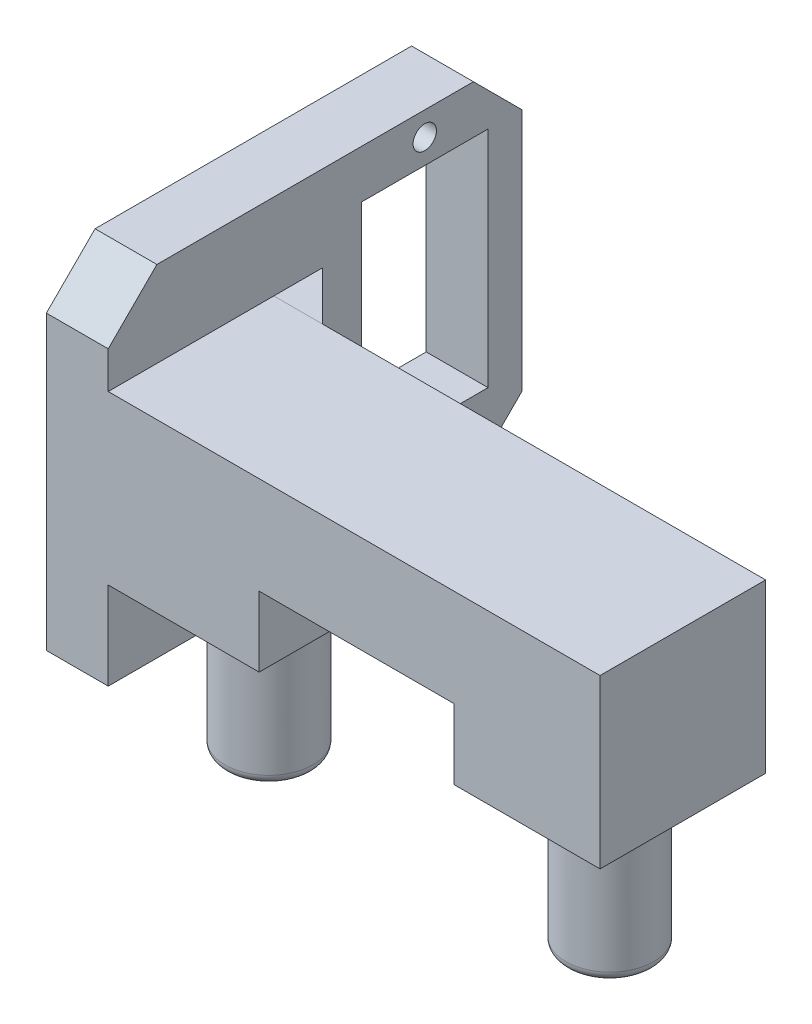
ISO-10303-21;
HEADER;
FILE_DESCRIPTION(('STEP AP214'),'2;1');
FILE_NAME('part.step','',(''),(''),'','','');
FILE_SCHEMA(('AUTOMOTIVE_DESIGN { 1 0 10303 214 1 1 1 1 }'));
ENDSEC;
DATA;
#1=APPLICATION_CONTEXT('core data for automotive mechanical design processes');
#2=APPLICATION_PROTOCOL_DEFINITION('international standard','automotive_design',2000,#1);
#3=PRODUCT_CONTEXT('',#1,'mechanical');
#4=PRODUCT('Part','Part','',(#3));
#5=PRODUCT_RELATED_PRODUCT_CATEGORY('part','',(#4));
#6=PRODUCT_DEFINITION_FORMATION('','',#4);
#7=PRODUCT_DEFINITION_CONTEXT('part definition',#1,'design');
#8=PRODUCT_DEFINITION('design','',#6,#7);
#9=PRODUCT_DEFINITION_SHAPE('','',#8);
#10=(LENGTH_UNIT() NAMED_UNIT(*) SI_UNIT(.MILLI.,.METRE.));
#11=(NAMED_UNIT(*) PLANE_ANGLE_UNIT() SI_UNIT($,.RADIAN.));
#12=(NAMED_UNIT(*) SI_UNIT($,.STERADIAN.) SOLID_ANGLE_UNIT());
#13=UNCERTAINTY_MEASURE_WITH_UNIT(LENGTH_MEASURE(1.E-05),#10,'distance_accuracy_value','');
#14=(GEOMETRIC_REPRESENTATION_CONTEXT(3) GLOBAL_UNCERTAINTY_ASSIGNED_CONTEXT((#13)) GLOBAL_UNIT_ASSIGNED_CONTEXT((#10,
#11,#12)) REPRESENTATION_CONTEXT('',''));
#15=CARTESIAN_POINT('',(0.,0.,0.));
#16=DIRECTION('',(0.,0.,1.));
#17=DIRECTION('',(1.,0.,0.));
#18=AXIS2_PLACEMENT_3D('',#15,#16,#17);
#19=CARTESIAN_POINT('',(-20.25,-7.,-8.5));
#20=DIRECTION('',(-0.707106781186547,0.,0.707106781186547));
#21=DIRECTION('',(0.707106781186548,0.,0.707106781186548));
#22=AXIS2_PLACEMENT_3D('',#19,#20,#21);
#23=PLANE('',#22);
#24=DIRECTION('',(0.707106781186548,0.,0.707106781186548));
#25=VECTOR('',#24,1.);
#26=CARTESIAN_POINT('',(-20.25,-4.,-8.5));
#27=LINE('',#26,#25);
#28=CARTESIAN_POINT('',(-25.25,-4.,-13.5));
#29=VERTEX_POINT('',#28);
#30=CARTESIAN_POINT('',(-20.25,-4.,-8.5));
#31=VERTEX_POINT('',#30);
#32=EDGE_CURVE('E107',#29,#31,#27,.T.);
#33=ORIENTED_EDGE('',*,*,#32,.T.);
#34=DIRECTION('',(0.,1.,0.));
#35=VECTOR('',#34,1.);
#36=CARTESIAN_POINT('',(-20.25,-7.,-8.5));
#37=LINE('',#36,#35);
#38=CARTESIAN_POINT('',(-20.25,-7.,-8.5));
#39=VERTEX_POINT('',#38);
#40=EDGE_CURVE('E12',#39,#31,#37,.T.);
#41=ORIENTED_EDGE('',*,*,#40,.F.);
#42=DIRECTION('',(0.707106781186548,0.,0.707106781186548));
#43=VECTOR('',#42,1.);
#44=CARTESIAN_POINT('',(-20.25,-7.,-8.5));
#45=LINE('',#44,#43);
#46=CARTESIAN_POINT('',(-25.25,-7.,-13.5));
#47=VERTEX_POINT('',#46);
#48=EDGE_CURVE('E100',#47,#39,#45,.T.);
#49=ORIENTED_EDGE('',*,*,#48,.F.);
#50=DIRECTION('',(0.,1.,0.));
#51=VECTOR('',#50,1.);
#52=CARTESIAN_POINT('',(-25.25,-7.,-13.5));
#53=LINE('',#52,#51);
#54=EDGE_CURVE('E108',#47,#29,#53,.T.);
#55=ORIENTED_EDGE('',*,*,#54,.T.);
#56=EDGE_LOOP('',(#33,#41,#49,#55));
#57=FACE_BOUND('',#56,.T.);
#58=ADVANCED_FACE('F60',(#57),#23,.F.);
#59=CARTESIAN_POINT('',(-25.25,-7.,-8.5));
#60=DIRECTION('',(0.,0.,-1.));
#61=DIRECTION('',(-1.,0.,0.));
#62=AXIS2_PLACEMENT_3D('',#59,#60,#61);
#63=PLANE('',#62);
#64=DIRECTION('',(-1.,0.,0.));
#65=VECTOR('',#64,1.);
#66=CARTESIAN_POINT('',(-25.25,-4.,-8.5));
#67=LINE('',#66,#65);
#68=CARTESIAN_POINT('',(-25.25,-4.,-8.5));
#69=VERTEX_POINT('',#68);
#70=EDGE_CURVE('E88',#31,#69,#67,.T.);
#71=ORIENTED_EDGE('',*,*,#70,.T.);
#72=DIRECTION('',(0.,1.,0.));
#73=VECTOR('',#72,1.);
#74=CARTESIAN_POINT('',(-25.25,-7.,-8.5));
#75=LINE('',#74,#73);
#76=CARTESIAN_POINT('',(-25.25,-7.,-8.5));
#77=VERTEX_POINT('',#76);
#78=EDGE_CURVE('E68',#77,#69,#75,.T.);
#79=ORIENTED_EDGE('',*,*,#78,.F.);
#80=DIRECTION('',(-1.,0.,0.));
#81=VECTOR('',#80,1.);
#82=CARTESIAN_POINT('',(-25.25,-7.,-8.5));
#83=LINE('',#82,#81);
#84=EDGE_CURVE('E96',#39,#77,#83,.T.);
#85=ORIENTED_EDGE('',*,*,#84,.F.);
#86=ORIENTED_EDGE('',*,*,#40,.T.);
#87=EDGE_LOOP('',(#71,#79,#85,#86));
#88=FACE_BOUND('',#87,.T.);
#89=ADVANCED_FACE('F97',(#88),#63,.F.);
#90=CARTESIAN_POINT('',(-25.25,-7.,-8.5));
#91=DIRECTION('',(1.,0.,0.));
#92=DIRECTION('',(0.,0.,-1.));
#93=AXIS2_PLACEMENT_3D('',#90,#91,#92);
#94=PLANE('',#93);
#95=DIRECTION('',(0.,0.,-1.));
#96=VECTOR('',#95,1.);
#97=CARTESIAN_POINT('',(-25.25,-4.,-8.5));
#98=LINE('',#97,#96);
#99=EDGE_CURVE('E93',#69,#29,#98,.T.);
#100=ORIENTED_EDGE('',*,*,#99,.T.);
#101=ORIENTED_EDGE('',*,*,#54,.F.);
#102=DIRECTION('',(0.,0.,-1.));
#103=VECTOR('',#102,1.);
#104=CARTESIAN_POINT('',(-25.25,-7.,-8.5));
#105=LINE('',#104,#103);
#106=EDGE_CURVE('E76',#77,#47,#105,.T.);
#107=ORIENTED_EDGE('',*,*,#106,.F.);
#108=ORIENTED_EDGE('',*,*,#78,.T.);
#109=EDGE_LOOP('',(#100,#101,#107,#108));
#110=FACE_BOUND('',#109,.T.);
#111=ADVANCED_FACE('F115',(#110),#94,.F.);
#112=CARTESIAN_POINT('',(0.,-7.,0.));
#113=DIRECTION('',(0.,-1.,0.));
#114=DIRECTION('',(0.,0.,-1.));
#115=AXIS2_PLACEMENT_3D('',#112,#113,#114);
#116=PLANE('',#115);
#117=ORIENTED_EDGE('',*,*,#48,.T.);
#118=ORIENTED_EDGE('',*,*,#84,.T.);
#119=ORIENTED_EDGE('',*,*,#106,.T.);
#120=EDGE_LOOP('',(#117,#118,#119));
#121=FACE_BOUND('',#120,.T.);
#122=ADVANCED_FACE('F103',(#121),#116,.T.);
#123=CARTESIAN_POINT('',(0.,-4.,0.));
#124=DIRECTION('',(0.,-1.,0.));
#125=DIRECTION('',(0.,0.,-1.));
#126=AXIS2_PLACEMENT_3D('',#123,#124,#125);
#127=PLANE('',#126);
#128=ORIENTED_EDGE('',*,*,#32,.F.);
#129=ORIENTED_EDGE('',*,*,#99,.F.);
#130=ORIENTED_EDGE('',*,*,#70,.F.);
#131=EDGE_LOOP('',(#128,#129,#130));
#132=FACE_BOUND('',#131,.T.);
#133=ADVANCED_FACE('F116',(#132),#127,.F.);
#134=CLOSED_SHELL('',(#58,#89,#111,#122,#133));
#135=MANIFOLD_SOLID_BREP('B2',#134);
#136=CARTESIAN_POINT('',(-20.25,0.,-8.5));
#137=DIRECTION('',(-0.707106781186547,0.,0.707106781186547));
#138=DIRECTION('',(0.707106781186548,0.,0.707106781186548));
#139=AXIS2_PLACEMENT_3D('',#136,#137,#138);
#140=PLANE('',#139);
#141=DIRECTION('',(0.707106781186548,0.,0.707106781186548));
#142=VECTOR('',#141,1.);
#143=CARTESIAN_POINT('',(-20.25,3.,-8.5));
#144=LINE('',#143,#142);
#145=CARTESIAN_POINT('',(-25.25,3.,-13.5));
#146=VERTEX_POINT('',#145);
#147=CARTESIAN_POINT('',(-20.25,3.,-8.5));
#148=VERTEX_POINT('',#147);
#149=EDGE_CURVE('E215',#146,#148,#144,.T.);
#150=ORIENTED_EDGE('',*,*,#149,.T.);
#151=DIRECTION('',(0.,1.,0.));
#152=VECTOR('',#151,1.);
#153=CARTESIAN_POINT('',(-20.25,0.,-8.5));
#154=LINE('',#153,#152);
#155=CARTESIAN_POINT('',(-20.25,0.,-8.5));
#156=VERTEX_POINT('',#155);
#157=EDGE_CURVE('E58',#156,#148,#154,.T.);
#158=ORIENTED_EDGE('',*,*,#157,.F.);
#159=DIRECTION('',(0.707106781186548,0.,0.707106781186548));
#160=VECTOR('',#159,1.);
#161=CARTESIAN_POINT('',(-20.25,0.,-8.5));
#162=LINE('',#161,#160);
#163=CARTESIAN_POINT('',(-25.25,0.,-13.5));
#164=VERTEX_POINT('',#163);
#165=EDGE_CURVE('E208',#164,#156,#162,.T.);
#166=ORIENTED_EDGE('',*,*,#165,.F.);
#167=DIRECTION('',(0.,1.,0.));
#168=VECTOR('',#167,1.);
#169=CARTESIAN_POINT('',(-25.25,0.,-13.5));
#170=LINE('',#169,#168);
#171=EDGE_CURVE('E216',#164,#146,#170,.T.);
#172=ORIENTED_EDGE('',*,*,#171,.T.);
#173=EDGE_LOOP('',(#150,#158,#166,#172));
#174=FACE_BOUND('',#173,.T.);
#175=ADVANCED_FACE('F168',(#174),#140,.F.);
#176=CARTESIAN_POINT('',(-25.25,0.,-8.5));
#177=DIRECTION('',(0.,0.,-1.));
#178=DIRECTION('',(-1.,0.,0.));
#179=AXIS2_PLACEMENT_3D('',#176,#177,#178);
#180=PLANE('',#179);
#181=DIRECTION('',(-1.,0.,0.));
#182=VECTOR('',#181,1.);
#183=CARTESIAN_POINT('',(-25.25,3.,-8.5));
#184=LINE('',#183,#182);
#185=CARTESIAN_POINT('',(-25.25,3.,-8.5));
#186=VERTEX_POINT('',#185);
#187=EDGE_CURVE('E196',#148,#186,#184,.T.);
#188=ORIENTED_EDGE('',*,*,#187,.T.);
#189=DIRECTION('',(0.,1.,0.));
#190=VECTOR('',#189,1.);
#191=CARTESIAN_POINT('',(-25.25,0.,-8.5));
#192=LINE('',#191,#190);
#193=CARTESIAN_POINT('',(-25.25,0.,-8.5));
#194=VERTEX_POINT('',#193);
#195=EDGE_CURVE('E176',#194,#186,#192,.T.);
#196=ORIENTED_EDGE('',*,*,#195,.F.);
#197=DIRECTION('',(-1.,0.,0.));
#198=VECTOR('',#197,1.);
#199=CARTESIAN_POINT('',(-25.25,0.,-8.5));
#200=LINE('',#199,#198);
#201=EDGE_CURVE('E204',#156,#194,#200,.T.);
#202=ORIENTED_EDGE('',*,*,#201,.F.);
#203=ORIENTED_EDGE('',*,*,#157,.T.);
#204=EDGE_LOOP('',(#188,#196,#202,#203));
#205=FACE_BOUND('',#204,.T.);
#206=ADVANCED_FACE('F205',(#205),#180,.F.);
#207=CARTESIAN_POINT('',(-25.25,0.,-8.5));
#208=DIRECTION('',(1.,0.,0.));
#209=DIRECTION('',(0.,0.,-1.));
#210=AXIS2_PLACEMENT_3D('',#207,#208,#209);
#211=PLANE('',#210);
#212=DIRECTION('',(0.,0.,-1.));
#213=VECTOR('',#212,1.);
#214=CARTESIAN_POINT('',(-25.25,3.,-8.5));
#215=LINE('',#214,#213);
#216=EDGE_CURVE('E201',#186,#146,#215,.T.);
#217=ORIENTED_EDGE('',*,*,#216,.T.);
#218=ORIENTED_EDGE('',*,*,#171,.F.);
#219=DIRECTION('',(0.,0.,-1.));
#220=VECTOR('',#219,1.);
#221=CARTESIAN_POINT('',(-25.25,0.,-8.5));
#222=LINE('',#221,#220);
#223=EDGE_CURVE('E184',#194,#164,#222,.T.);
#224=ORIENTED_EDGE('',*,*,#223,.F.);
#225=ORIENTED_EDGE('',*,*,#195,.T.);
#226=EDGE_LOOP('',(#217,#218,#224,#225));
#227=FACE_BOUND('',#226,.T.);
#228=ADVANCED_FACE('F223',(#227),#211,.F.);
#229=CARTESIAN_POINT('',(0.,0.,0.));
#230=DIRECTION('',(0.,-1.,0.));
#231=DIRECTION('',(0.,0.,-1.));
#232=AXIS2_PLACEMENT_3D('',#229,#230,#231);
#233=PLANE('',#232);
#234=ORIENTED_EDGE('',*,*,#165,.T.);
#235=ORIENTED_EDGE('',*,*,#201,.T.);
#236=ORIENTED_EDGE('',*,*,#223,.T.);
#237=EDGE_LOOP('',(#234,#235,#236));
#238=FACE_BOUND('',#237,.T.);
#239=ADVANCED_FACE('F211',(#238),#233,.T.);
#240=CARTESIAN_POINT('',(0.,3.,0.));
#241=DIRECTION('',(0.,-1.,0.));
#242=DIRECTION('',(0.,0.,-1.));
#243=AXIS2_PLACEMENT_3D('',#240,#241,#242);
#244=PLANE('',#243);
#245=ORIENTED_EDGE('',*,*,#149,.F.);
#246=ORIENTED_EDGE('',*,*,#216,.F.);
#247=ORIENTED_EDGE('',*,*,#187,.F.);
#248=EDGE_LOOP('',(#245,#246,#247));
#249=FACE_BOUND('',#248,.T.);
#250=ADVANCED_FACE('F224',(#249),#244,.F.);
#251=CLOSED_SHELL('',(#175,#206,#228,#239,#250));
#252=MANIFOLD_SOLID_BREP('B6',#251);
#253=CARTESIAN_POINT('',(-20.25,7.,-8.5));
#254=DIRECTION('',(-0.707106781186547,0.,0.707106781186547));
#255=DIRECTION('',(0.707106781186548,0.,0.707106781186548));
#256=AXIS2_PLACEMENT_3D('',#253,#254,#255);
#257=PLANE('',#256);
#258=DIRECTION('',(0.707106781186548,0.,0.707106781186548));
#259=VECTOR('',#258,1.);
#260=CARTESIAN_POINT('',(-20.25,10.,-8.5));
#261=LINE('',#260,#259);
#262=CARTESIAN_POINT('',(-25.25,10.,-13.5));
#263=VERTEX_POINT('',#262);
#264=CARTESIAN_POINT('',(-20.25,10.,-8.5));
#265=VERTEX_POINT('',#264);
#266=EDGE_CURVE('E323',#263,#265,#261,.T.);
#267=ORIENTED_EDGE('',*,*,#266,.T.);
#268=DIRECTION('',(0.,1.,0.));
#269=VECTOR('',#268,1.);
#270=CARTESIAN_POINT('',(-20.25,7.,-8.5));
#271=LINE('',#270,#269);
#272=CARTESIAN_POINT('',(-20.25,7.,-8.5));
#273=VERTEX_POINT('',#272);
#274=EDGE_CURVE('E166',#273,#265,#271,.T.);
#275=ORIENTED_EDGE('',*,*,#274,.F.);
#276=DIRECTION('',(0.707106781186548,0.,0.707106781186548));
#277=VECTOR('',#276,1.);
#278=CARTESIAN_POINT('',(-20.25,7.,-8.5));
#279=LINE('',#278,#277);
#280=CARTESIAN_POINT('',(-25.25,7.,-13.5));
#281=VERTEX_POINT('',#280);
#282=EDGE_CURVE('E316',#281,#273,#279,.T.);
#283=ORIENTED_EDGE('',*,*,#282,.F.);
#284=DIRECTION('',(0.,1.,0.));
#285=VECTOR('',#284,1.);
#286=CARTESIAN_POINT('',(-25.25,7.,-13.5));
#287=LINE('',#286,#285);
#288=EDGE_CURVE('E324',#281,#263,#287,.T.);
#289=ORIENTED_EDGE('',*,*,#288,.T.);
#290=EDGE_LOOP('',(#267,#275,#283,#289));
#291=FACE_BOUND('',#290,.T.);
#292=ADVANCED_FACE('F276',(#291),#257,.F.);
#293=CARTESIAN_POINT('',(-25.25,7.,-8.5));
#294=DIRECTION('',(0.,0.,-1.));
#295=DIRECTION('',(-1.,0.,0.));
#296=AXIS2_PLACEMENT_3D('',#293,#294,#295);
#297=PLANE('',#296);
#298=DIRECTION('',(-1.,0.,0.));
#299=VECTOR('',#298,1.);
#300=CARTESIAN_POINT('',(-25.25,10.,-8.5));
#301=LINE('',#300,#299);
#302=CARTESIAN_POINT('',(-25.25,10.,-8.5));
#303=VERTEX_POINT('',#302);
#304=EDGE_CURVE('E304',#265,#303,#301,.T.);
#305=ORIENTED_EDGE('',*,*,#304,.T.);
#306=DIRECTION('',(0.,1.,0.));
#307=VECTOR('',#306,1.);
#308=CARTESIAN_POINT('',(-25.25,7.,-8.5));
#309=LINE('',#308,#307);
#310=CARTESIAN_POINT('',(-25.25,7.,-8.5));
#311=VERTEX_POINT('',#310);
#312=EDGE_CURVE('E284',#311,#303,#309,.T.);
#313=ORIENTED_EDGE('',*,*,#312,.F.);
#314=DIRECTION('',(-1.,0.,0.));
#315=VECTOR('',#314,1.);
#316=CARTESIAN_POINT('',(-25.25,7.,-8.5));
#317=LINE('',#316,#315);
#318=EDGE_CURVE('E312',#273,#311,#317,.T.);
#319=ORIENTED_EDGE('',*,*,#318,.F.);
#320=ORIENTED_EDGE('',*,*,#274,.T.);
#321=EDGE_LOOP('',(#305,#313,#319,#320));
#322=FACE_BOUND('',#321,.T.);
#323=ADVANCED_FACE('F313',(#322),#297,.F.);
#324=CARTESIAN_POINT('',(-25.25,7.,-8.5));
#325=DIRECTION('',(1.,0.,0.));
#326=DIRECTION('',(0.,0.,-1.));
#327=AXIS2_PLACEMENT_3D('',#324,#325,#326);
#328=PLANE('',#327);
#329=DIRECTION('',(0.,0.,-1.));
#330=VECTOR('',#329,1.);
#331=CARTESIAN_POINT('',(-25.25,10.,-8.5));
#332=LINE('',#331,#330);
#333=EDGE_CURVE('E309',#303,#263,#332,.T.);
#334=ORIENTED_EDGE('',*,*,#333,.T.);
#335=ORIENTED_EDGE('',*,*,#288,.F.);
#336=DIRECTION('',(0.,0.,-1.));
#337=VECTOR('',#336,1.);
#338=CARTESIAN_POINT('',(-25.25,7.,-8.5));
#339=LINE('',#338,#337);
#340=EDGE_CURVE('E292',#311,#281,#339,.T.);
#341=ORIENTED_EDGE('',*,*,#340,.F.);
#342=ORIENTED_EDGE('',*,*,#312,.T.);
#343=EDGE_LOOP('',(#334,#335,#341,#342));
#344=FACE_BOUND('',#343,.T.);
#345=ADVANCED_FACE('F331',(#344),#328,.F.);
#346=CARTESIAN_POINT('',(0.,7.,0.));
#347=DIRECTION('',(0.,-1.,0.));
#348=DIRECTION('',(0.,0.,-1.));
#349=AXIS2_PLACEMENT_3D('',#346,#347,#348);
#350=PLANE('',#349);
#351=ORIENTED_EDGE('',*,*,#282,.T.);
#352=ORIENTED_EDGE('',*,*,#318,.T.);
#353=ORIENTED_EDGE('',*,*,#340,.T.);
#354=EDGE_LOOP('',(#351,#352,#353));
#355=FACE_BOUND('',#354,.T.);
#356=ADVANCED_FACE('F319',(#355),#350,.T.);
#357=CARTESIAN_POINT('',(0.,10.,0.));
#358=DIRECTION('',(0.,-1.,0.));
#359=DIRECTION('',(0.,0.,-1.));
#360=AXIS2_PLACEMENT_3D('',#357,#358,#359);
#361=PLANE('',#360);
#362=ORIENTED_EDGE('',*,*,#266,.F.);
#363=ORIENTED_EDGE('',*,*,#333,.F.);
#364=ORIENTED_EDGE('',*,*,#304,.F.);
#365=EDGE_LOOP('',(#362,#363,#364));
#366=FACE_BOUND('',#365,.T.);
#367=ADVANCED_FACE('F332',(#366),#361,.F.);
#368=CLOSED_SHELL('',(#292,#323,#345,#356,#367));
#369=MANIFOLD_SOLID_BREP('B52',#368);
#370=CARTESIAN_POINT('',(-31.6,0.,0.));
#371=DIRECTION('',(1.,0.,0.));
#372=DIRECTION('',(0.,0.,-1.));
#373=AXIS2_PLACEMENT_3D('',#370,#371,#372);
#374=PLANE('',#373);
#375=CARTESIAN_POINT('',(-31.6,-11.4369999999982,-24.));
#376=DIRECTION('',(-1.,0.,0.));
#377=DIRECTION('',(0.,0.,1.));
#378=AXIS2_PLACEMENT_3D('',#375,#376,#377);
#379=CIRCLE('',#378,1.19999999999999);
#380=CARTESIAN_POINT('',(-31.6,-11.4369999999982,-22.8));
#381=VERTEX_POINT('',#380);
#382=EDGE_CURVE('E810',#381,#381,#379,.T.);
#383=ORIENTED_EDGE('',*,*,#382,.F.);
#384=EDGE_LOOP('',(#383));
#385=FACE_BOUND('',#384,.T.);
#386=DIRECTION('',(0.,-1.,0.));
#387=VECTOR('',#386,1.);
#388=CARTESIAN_POINT('',(-31.6,13.847,-17.5));
#389=LINE('',#388,#387);
#390=CARTESIAN_POINT('',(-31.6,13.847,-17.5));
#391=VERTEX_POINT('',#390);
#392=CARTESIAN_POINT('',(-31.6,-9.153,-17.5));
#393=VERTEX_POINT('',#392);
#394=EDGE_CURVE('E546',#391,#393,#389,.T.);
#395=ORIENTED_EDGE('',*,*,#394,.T.);
#396=DIRECTION('',(0.,0.,1.));
#397=VECTOR('',#396,1.);
#398=CARTESIAN_POINT('',(-31.6,-9.153,-30.5));
#399=LINE('',#398,#397);
#400=CARTESIAN_POINT('',(-31.6,-9.153,-30.5));
#401=VERTEX_POINT('',#400);
#402=EDGE_CURVE('E818',#401,#393,#399,.T.);
#403=ORIENTED_EDGE('',*,*,#402,.F.);
#404=DIRECTION('',(0.,-1.,0.));
#405=VECTOR('',#404,1.);
#406=CARTESIAN_POINT('',(-31.6,13.847,-30.5));
#407=LINE('',#406,#405);
#408=CARTESIAN_POINT('',(-31.6,13.847,-30.5));
#409=VERTEX_POINT('',#408);
#410=EDGE_CURVE('E517',#409,#401,#407,.T.);
#411=ORIENTED_EDGE('',*,*,#410,.F.);
#412=DIRECTION('',(0.,0.,1.));
#413=VECTOR('',#412,1.);
#414=CARTESIAN_POINT('',(-31.6,13.847,-30.5));
#415=LINE('',#414,#413);
#416=EDGE_CURVE('E544',#409,#391,#415,.T.);
#417=ORIENTED_EDGE('',*,*,#416,.T.);
#418=EDGE_LOOP('',(#395,#403,#411,#417));
#419=FACE_BOUND('',#418,.T.);
#420=DIRECTION('',(0.,0.,-1.));
#421=VECTOR('',#420,1.);
#422=CARTESIAN_POINT('',(-31.6,18.8,8.5));
#423=LINE('',#422,#421);
#424=CARTESIAN_POINT('',(-31.6,18.8,3.5));
#425=VERTEX_POINT('',#424);
#426=CARTESIAN_POINT('',(-31.6,18.8,-29.));
#427=VERTEX_POINT('',#426);
#428=EDGE_CURVE('E550',#425,#427,#423,.T.);
#429=ORIENTED_EDGE('',*,*,#428,.T.);
#430=DIRECTION('',(0.,0.707106781186546,0.707106781186549));
#431=VECTOR('',#430,1.);
#432=CARTESIAN_POINT('',(-31.6,13.8,-34.));
#433=LINE('',#432,#431);
#434=CARTESIAN_POINT('',(-31.6,13.8,-34.));
#435=VERTEX_POINT('',#434);
#436=EDGE_CURVE('E648',#427,#435,#433,.F.);
#437=ORIENTED_EDGE('',*,*,#436,.T.);
#438=DIRECTION('',(0.,-1.,0.));
#439=VECTOR('',#438,1.);
#440=CARTESIAN_POINT('',(-31.6,18.8,-34.));
#441=LINE('',#440,#439);
#442=CARTESIAN_POINT('',(-31.6,-11.2,-34.));
#443=VERTEX_POINT('',#442);
#444=EDGE_CURVE('E554',#435,#443,#441,.T.);
#445=ORIENTED_EDGE('',*,*,#444,.T.);
#446=DIRECTION('',(0.,0.707106781186548,-0.707106781186547));
#447=VECTOR('',#446,1.);
#448=CARTESIAN_POINT('',(-31.6,-16.2,-29.));
#449=LINE('',#448,#447);
#450=CARTESIAN_POINT('',(-31.6,-16.2,-29.));
#451=VERTEX_POINT('',#450);
#452=EDGE_CURVE('E391',#443,#451,#449,.F.);
#453=ORIENTED_EDGE('',*,*,#452,.T.);
#454=DIRECTION('',(0.,0.,1.));
#455=VECTOR('',#454,1.);
#456=CARTESIAN_POINT('',(-31.6,-16.2,8.50000000000001));
#457=LINE('',#456,#455);
#458=CARTESIAN_POINT('',(-31.6,-16.2,8.50000000000001));
#459=VERTEX_POINT('',#458);
#460=EDGE_CURVE('E556',#451,#459,#457,.T.);
#461=ORIENTED_EDGE('',*,*,#460,.T.);
#462=DIRECTION('',(0.,1.,0.));
#463=VECTOR('',#462,1.);
#464=CARTESIAN_POINT('',(-31.6,18.8,8.5));
#465=LINE('',#464,#463);
#466=CARTESIAN_POINT('',(-31.6,13.8,8.5));
#467=VERTEX_POINT('',#466);
#468=EDGE_CURVE('E548',#459,#467,#465,.T.);
#469=ORIENTED_EDGE('',*,*,#468,.T.);
#470=DIRECTION('',(0.,-0.707106781186549,0.707106781186546));
#471=VECTOR('',#470,1.);
#472=CARTESIAN_POINT('',(-31.6,18.8,3.5));
#473=LINE('',#472,#471);
#474=EDGE_CURVE('E645',#467,#425,#473,.F.);
#475=ORIENTED_EDGE('',*,*,#474,.T.);
#476=EDGE_LOOP('',(#429,#437,#445,#453,#461,#469,#475));
#477=FACE_BOUND('',#476,.T.);
#478=CARTESIAN_POINT('',(-31.6,16.363,-24.));
#479=DIRECTION('',(-1.,0.,0.));
#480=DIRECTION('',(0.,0.,1.));
#481=AXIS2_PLACEMENT_3D('',#478,#479,#480);
#482=CIRCLE('',#481,1.19999999999999);
#483=CARTESIAN_POINT('',(-31.6,16.363,-22.8));
#484=VERTEX_POINT('',#483);
#485=EDGE_CURVE('E805',#484,#484,#482,.T.);
#486=ORIENTED_EDGE('',*,*,#485,.F.);
#487=EDGE_LOOP('',(#486));
#488=FACE_BOUND('',#487,.T.);
#489=ADVANCED_FACE('F376',(#385,#419,#477,#488),#374,.F.);
#490=CARTESIAN_POINT('',(0.,0.,0.));
#491=DIRECTION('',(0.,1.,0.));
#492=DIRECTION('',(0.,0.,1.));
#493=AXIS2_PLACEMENT_3D('',#490,#491,#492);
#494=PLANE('',#493);
#495=DIRECTION('',(0.,0.,-1.));
#496=VECTOR('',#495,1.);
#497=CARTESIAN_POINT('',(10.25,0.,8.5));
#498=LINE('',#497,#496);
#499=CARTESIAN_POINT('',(10.25,0.,8.5));
#500=VERTEX_POINT('',#499);
#501=CARTESIAN_POINT('',(10.25,0.,-8.5));
#502=VERTEX_POINT('',#501);
#503=EDGE_CURVE('E577',#500,#502,#498,.T.);
#504=ORIENTED_EDGE('',*,*,#503,.F.);
#505=DIRECTION('',(1.,0.,0.));
#506=VECTOR('',#505,1.);
#507=CARTESIAN_POINT('',(-25.25,0.,8.5));
#508=LINE('',#507,#506);
#509=CARTESIAN_POINT('',(-9.75,0.,8.5));
#510=VERTEX_POINT('',#509);
#511=EDGE_CURVE('E612',#510,#500,#508,.T.);
#512=ORIENTED_EDGE('',*,*,#511,.F.);
#513=DIRECTION('',(0.,0.,1.));
#514=VECTOR('',#513,1.);
#515=CARTESIAN_POINT('',(-9.75,0.,-8.5));
#516=LINE('',#515,#514);
#517=CARTESIAN_POINT('',(-9.75,0.,-8.5));
#518=VERTEX_POINT('',#517);
#519=EDGE_CURVE('E579',#518,#510,#516,.T.);
#520=ORIENTED_EDGE('',*,*,#519,.F.);
#521=DIRECTION('',(-1.,0.,0.));
#522=VECTOR('',#521,1.);
#523=CARTESIAN_POINT('',(-25.25,0.,-8.5));
#524=LINE('',#523,#522);
#525=EDGE_CURVE('E607',#502,#518,#524,.T.);
#526=ORIENTED_EDGE('',*,*,#525,.F.);
#527=EDGE_LOOP('',(#504,#512,#520,#526));
#528=FACE_BOUND('',#527,.T.);
#529=ADVANCED_FACE('F680',(#528),#494,.F.);
#530=CARTESIAN_POINT('',(25.25,10.,-8.5));
#531=DIRECTION('',(-1.,0.,0.));
#532=DIRECTION('',(0.,0.,1.));
#533=AXIS2_PLACEMENT_3D('',#530,#531,#532);
#534=PLANE('',#533);
#535=DIRECTION('',(0.,-1.,0.));
#536=VECTOR('',#535,1.);
#537=CARTESIAN_POINT('',(25.25,10.,8.5));
#538=LINE('',#537,#536);
#539=CARTESIAN_POINT('',(25.25,10.,8.5));
#540=VERTEX_POINT('',#539);
#541=CARTESIAN_POINT('',(25.25,-7.2,8.5));
#542=VERTEX_POINT('',#541);
#543=EDGE_CURVE('E620',#540,#542,#538,.T.);
#544=ORIENTED_EDGE('',*,*,#543,.T.);
#545=DIRECTION('',(0.,0.,1.));
#546=VECTOR('',#545,1.);
#547=CARTESIAN_POINT('',(25.25,-7.2,8.5));
#548=LINE('',#547,#546);
#549=CARTESIAN_POINT('',(25.25,-7.2,-8.5));
#550=VERTEX_POINT('',#549);
#551=EDGE_CURVE('E580',#550,#542,#548,.T.);
#552=ORIENTED_EDGE('',*,*,#551,.F.);
#553=DIRECTION('',(0.,-1.,0.));
#554=VECTOR('',#553,1.);
#555=CARTESIAN_POINT('',(25.25,10.,-8.5));
#556=LINE('',#555,#554);
#557=CARTESIAN_POINT('',(25.25,10.,-8.5));
#558=VERTEX_POINT('',#557);
#559=EDGE_CURVE('E627',#558,#550,#556,.T.);
#560=ORIENTED_EDGE('',*,*,#559,.F.);
#561=DIRECTION('',(0.,0.,-1.));
#562=VECTOR('',#561,1.);
#563=CARTESIAN_POINT('',(25.25,10.,-8.5));
#564=LINE('',#563,#562);
#565=EDGE_CURVE('E608',#540,#558,#564,.T.);
#566=ORIENTED_EDGE('',*,*,#565,.F.);
#567=EDGE_LOOP('',(#544,#552,#560,#566));
#568=FACE_BOUND('',#567,.T.);
#569=ADVANCED_FACE('F688',(#568),#534,.F.);
#570=CARTESIAN_POINT('',(-25.25,10.,-8.5));
#571=DIRECTION('',(0.,0.,1.));
#572=DIRECTION('',(1.,0.,0.));
#573=AXIS2_PLACEMENT_3D('',#570,#571,#572);
#574=PLANE('',#573);
#575=ORIENTED_EDGE('',*,*,#559,.T.);
#576=DIRECTION('',(1.,0.,0.));
#577=VECTOR('',#576,1.);
#578=CARTESIAN_POINT('',(25.25,-7.2,-8.5));
#579=LINE('',#578,#577);
#580=CARTESIAN_POINT('',(10.25,-7.2,-8.5));
#581=VERTEX_POINT('',#580);
#582=EDGE_CURVE('E576',#581,#550,#579,.T.);
#583=ORIENTED_EDGE('',*,*,#582,.F.);
#584=DIRECTION('',(0.,1.,0.));
#585=VECTOR('',#584,1.);
#586=CARTESIAN_POINT('',(10.25,-7.2,-8.5));
#587=LINE('',#586,#585);
#588=EDGE_CURVE('E573',#581,#502,#587,.T.);
#589=ORIENTED_EDGE('',*,*,#588,.T.);
#590=ORIENTED_EDGE('',*,*,#525,.T.);
#591=DIRECTION('',(0.,1.,0.));
#592=VECTOR('',#591,1.);
#593=CARTESIAN_POINT('',(-9.75,-7.2,-8.5));
#594=LINE('',#593,#592);
#595=CARTESIAN_POINT('',(-9.75,-7.2,-8.5));
#596=VERTEX_POINT('',#595);
#597=EDGE_CURVE('E604',#596,#518,#594,.T.);
#598=ORIENTED_EDGE('',*,*,#597,.F.);
#599=DIRECTION('',(1.,0.,0.));
#600=VECTOR('',#599,1.);
#601=CARTESIAN_POINT('',(-25.25,-7.2,-8.5));
#602=LINE('',#601,#600);
#603=CARTESIAN_POINT('',(-25.25,-7.2,-8.5));
#604=VERTEX_POINT('',#603);
#605=EDGE_CURVE('E592',#604,#596,#602,.T.);
#606=ORIENTED_EDGE('',*,*,#605,.F.);
#607=DIRECTION('',(0.,-1.,0.));
#608=VECTOR('',#607,1.);
#609=CARTESIAN_POINT('',(-25.25,10.,-8.5));
#610=LINE('',#609,#608);
#611=CARTESIAN_POINT('',(-25.25,10.,-8.5));
#612=VERTEX_POINT('',#611);
#613=EDGE_CURVE('E625',#612,#604,#610,.T.);
#614=ORIENTED_EDGE('',*,*,#613,.F.);
#615=DIRECTION('',(-1.,0.,0.));
#616=VECTOR('',#615,1.);
#617=CARTESIAN_POINT('',(-25.25,10.,-8.5));
#618=LINE('',#617,#616);
#619=EDGE_CURVE('E611',#558,#612,#618,.T.);
#620=ORIENTED_EDGE('',*,*,#619,.F.);
#621=EDGE_LOOP('',(#575,#583,#589,#590,#598,#606,#614,#620));
#622=FACE_BOUND('',#621,.T.);
#623=ADVANCED_FACE('F733',(#622),#574,.F.);
#624=CARTESIAN_POINT('',(-25.25,10.,8.5));
#625=DIRECTION('',(0.,0.,-1.));
#626=DIRECTION('',(-1.,0.,0.));
#627=AXIS2_PLACEMENT_3D('',#624,#625,#626);
#628=PLANE('',#627);
#629=DIRECTION('',(0.,1.,0.));
#630=VECTOR('',#629,1.);
#631=CARTESIAN_POINT('',(-25.25,18.8,8.5));
#632=LINE('',#631,#630);
#633=CARTESIAN_POINT('',(-25.25,10.,8.5));
#634=VERTEX_POINT('',#633);
#635=CARTESIAN_POINT('',(-25.25,13.8,8.5));
#636=VERTEX_POINT('',#635);
#637=EDGE_CURVE('E541',#634,#636,#632,.T.);
#638=ORIENTED_EDGE('',*,*,#637,.T.);
#639=DIRECTION('',(-1.,0.,0.));
#640=VECTOR('',#639,1.);
#641=CARTESIAN_POINT('',(-25.25,13.8,8.5));
#642=LINE('',#641,#640);
#643=EDGE_CURVE('E399',#636,#467,#642,.T.);
#644=ORIENTED_EDGE('',*,*,#643,.T.);
#645=ORIENTED_EDGE('',*,*,#468,.F.);
#646=DIRECTION('',(1.,0.,0.));
#647=VECTOR('',#646,1.);
#648=CARTESIAN_POINT('',(-31.6,-16.2,8.50000000000001));
#649=LINE('',#648,#647);
#650=CARTESIAN_POINT('',(-25.25,-16.2,8.50000000000001));
#651=VERTEX_POINT('',#650);
#652=EDGE_CURVE('E558',#459,#651,#649,.T.);
#653=ORIENTED_EDGE('',*,*,#652,.T.);
#654=CARTESIAN_POINT('',(-25.25,-7.2,8.50000000000001));
#655=VERTEX_POINT('',#654);
#656=EDGE_CURVE('E559',#651,#655,#632,.T.);
#657=ORIENTED_EDGE('',*,*,#656,.T.);
#658=DIRECTION('',(-1.,0.,0.));
#659=VECTOR('',#658,1.);
#660=CARTESIAN_POINT('',(-25.25,-7.2,8.5));
#661=LINE('',#660,#659);
#662=CARTESIAN_POINT('',(-9.75,-7.2,8.5));
#663=VERTEX_POINT('',#662);
#664=EDGE_CURVE('E596',#663,#655,#661,.T.);
#665=ORIENTED_EDGE('',*,*,#664,.F.);
#666=DIRECTION('',(0.,1.,0.));
#667=VECTOR('',#666,1.);
#668=CARTESIAN_POINT('',(-9.75,-7.2,8.5));
#669=LINE('',#668,#667);
#670=EDGE_CURVE('E599',#663,#510,#669,.T.);
#671=ORIENTED_EDGE('',*,*,#670,.T.);
#672=ORIENTED_EDGE('',*,*,#511,.T.);
#673=DIRECTION('',(0.,1.,0.));
#674=VECTOR('',#673,1.);
#675=CARTESIAN_POINT('',(10.25,-7.2,8.5));
#676=LINE('',#675,#674);
#677=CARTESIAN_POINT('',(10.25,-7.2,8.5));
#678=VERTEX_POINT('',#677);
#679=EDGE_CURVE('E571',#678,#500,#676,.T.);
#680=ORIENTED_EDGE('',*,*,#679,.F.);
#681=DIRECTION('',(-1.,0.,0.));
#682=VECTOR('',#681,1.);
#683=CARTESIAN_POINT('',(25.25,-7.2,8.5));
#684=LINE('',#683,#682);
#685=EDGE_CURVE('E585',#542,#678,#684,.T.);
#686=ORIENTED_EDGE('',*,*,#685,.F.);
#687=ORIENTED_EDGE('',*,*,#543,.F.);
#688=DIRECTION('',(1.,0.,0.));
#689=VECTOR('',#688,1.);
#690=CARTESIAN_POINT('',(-25.25,10.,8.5));
#691=LINE('',#690,#689);
#692=EDGE_CURVE('E618',#634,#540,#691,.T.);
#693=ORIENTED_EDGE('',*,*,#692,.F.);
#694=EDGE_LOOP('',(#638,#644,#645,#653,#657,#665,#671,#672,#680,#686,#687,#693));
#695=FACE_BOUND('',#694,.T.);
#696=ADVANCED_FACE('F729',(#695),#628,.F.);
#697=CARTESIAN_POINT('',(0.,10.,0.));
#698=DIRECTION('',(0.,1.,0.));
#699=DIRECTION('',(0.,0.,1.));
#700=AXIS2_PLACEMENT_3D('',#697,#698,#699);
#701=PLANE('',#700);
#702=ORIENTED_EDGE('',*,*,#565,.T.);
#703=ORIENTED_EDGE('',*,*,#619,.T.);
#704=DIRECTION('',(0.,0.,1.));
#705=VECTOR('',#704,1.);
#706=CARTESIAN_POINT('',(-25.25,10.,-8.5));
#707=LINE('',#706,#705);
#708=EDGE_CURVE('E615',#612,#634,#707,.T.);
#709=ORIENTED_EDGE('',*,*,#708,.T.);
#710=ORIENTED_EDGE('',*,*,#692,.T.);
#711=EDGE_LOOP('',(#702,#703,#709,#710));
#712=FACE_BOUND('',#711,.T.);
#713=ADVANCED_FACE('F726',(#712),#701,.T.);
#714=CARTESIAN_POINT('',(-9.75,-7.2,-8.5));
#715=DIRECTION('',(-1.,0.,0.));
#716=DIRECTION('',(0.,0.,1.));
#717=AXIS2_PLACEMENT_3D('',#714,#715,#716);
#718=PLANE('',#717);
#719=ORIENTED_EDGE('',*,*,#519,.T.);
#720=ORIENTED_EDGE('',*,*,#670,.F.);
#721=DIRECTION('',(0.,0.,1.));
#722=VECTOR('',#721,1.);
#723=CARTESIAN_POINT('',(-9.75,-7.2,-8.5));
#724=LINE('',#723,#722);
#725=EDGE_CURVE('E594',#596,#663,#724,.T.);
#726=ORIENTED_EDGE('',*,*,#725,.F.);
#727=ORIENTED_EDGE('',*,*,#597,.T.);
#728=EDGE_LOOP('',(#719,#720,#726,#727));
#729=FACE_BOUND('',#728,.T.);
#730=ADVANCED_FACE('F722',(#729),#718,.F.);
#731=CARTESIAN_POINT('',(0.,-7.2,0.));
#732=DIRECTION('',(0.,1.,0.));
#733=DIRECTION('',(0.,0.,1.));
#734=AXIS2_PLACEMENT_3D('',#731,#732,#733);
#735=PLANE('',#734);
#736=CARTESIAN_POINT('',(-17.25,-7.2,0.));
#737=DIRECTION('',(0.,1.,0.));
#738=DIRECTION('',(0.,0.,1.));
#739=AXIS2_PLACEMENT_3D('',#736,#737,#738);
#740=CIRCLE('',#739,4.5);
#741=CARTESIAN_POINT('',(-17.25,-7.2,4.5));
#742=VERTEX_POINT('',#741);
#743=EDGE_CURVE('E657',#742,#742,#740,.F.);
#744=ORIENTED_EDGE('',*,*,#743,.F.);
#745=EDGE_LOOP('',(#744));
#746=FACE_BOUND('',#745,.T.);
#747=DIRECTION('',(0.,0.,-1.));
#748=VECTOR('',#747,1.);
#749=CARTESIAN_POINT('',(-25.25,-7.2,-8.5));
#750=LINE('',#749,#748);
#751=EDGE_CURVE('E589',#655,#604,#750,.T.);
#752=ORIENTED_EDGE('',*,*,#751,.T.);
#753=ORIENTED_EDGE('',*,*,#605,.T.);
#754=ORIENTED_EDGE('',*,*,#725,.T.);
#755=ORIENTED_EDGE('',*,*,#664,.T.);
#756=EDGE_LOOP('',(#752,#753,#754,#755));
#757=FACE_BOUND('',#756,.T.);
#758=ADVANCED_FACE('F715',(#746,#757),#735,.F.);
#759=CARTESIAN_POINT('',(10.25,-7.2,8.5));
#760=DIRECTION('',(1.,0.,0.));
#761=DIRECTION('',(0.,0.,-1.));
#762=AXIS2_PLACEMENT_3D('',#759,#760,#761);
#763=PLANE('',#762);
#764=ORIENTED_EDGE('',*,*,#503,.T.);
#765=ORIENTED_EDGE('',*,*,#588,.F.);
#766=DIRECTION('',(0.,0.,-1.));
#767=VECTOR('',#766,1.);
#768=CARTESIAN_POINT('',(10.25,-7.2,8.5));
#769=LINE('',#768,#767);
#770=EDGE_CURVE('E583',#678,#581,#769,.T.);
#771=ORIENTED_EDGE('',*,*,#770,.F.);
#772=ORIENTED_EDGE('',*,*,#679,.T.);
#773=EDGE_LOOP('',(#764,#765,#771,#772));
#774=FACE_BOUND('',#773,.T.);
#775=ADVANCED_FACE('F712',(#774),#763,.F.);
#776=CARTESIAN_POINT('',(0.,-7.2,0.));
#777=DIRECTION('',(0.,1.,0.));
#778=DIRECTION('',(0.,0.,1.));
#779=AXIS2_PLACEMENT_3D('',#776,#777,#778);
#780=PLANE('',#779);
#781=CARTESIAN_POINT('',(17.75,-7.2,0.));
#782=DIRECTION('',(0.,1.,0.));
#783=DIRECTION('',(0.,0.,1.));
#784=AXIS2_PLACEMENT_3D('',#781,#782,#783);
#785=CIRCLE('',#784,4.5);
#786=CARTESIAN_POINT('',(17.75,-7.2,4.5));
#787=VERTEX_POINT('',#786);
#788=EDGE_CURVE('E654',#787,#787,#785,.F.);
#789=ORIENTED_EDGE('',*,*,#788,.F.);
#790=EDGE_LOOP('',(#789));
#791=FACE_BOUND('',#790,.T.);
#792=ORIENTED_EDGE('',*,*,#551,.T.);
#793=ORIENTED_EDGE('',*,*,#685,.T.);
#794=ORIENTED_EDGE('',*,*,#770,.T.);
#795=ORIENTED_EDGE('',*,*,#582,.T.);
#796=EDGE_LOOP('',(#792,#793,#794,#795));
#797=FACE_BOUND('',#796,.T.);
#798=ADVANCED_FACE('F699',(#791,#797),#780,.F.);
#799=CARTESIAN_POINT('',(-25.25,0.,0.));
#800=DIRECTION('',(1.,0.,0.));
#801=DIRECTION('',(0.,0.,-1.));
#802=AXIS2_PLACEMENT_3D('',#799,#800,#801);
#803=PLANE('',#802);
#804=CARTESIAN_POINT('',(-25.25,16.363,-24.));
#805=DIRECTION('',(1.,0.,0.));
#806=DIRECTION('',(0.,0.,-1.));
#807=AXIS2_PLACEMENT_3D('',#804,#805,#806);
#808=CIRCLE('',#807,1.19999999999999);
#809=CARTESIAN_POINT('',(-25.25,16.363,-25.2));
#810=VERTEX_POINT('',#809);
#811=EDGE_CURVE('E807',#810,#810,#808,.T.);
#812=ORIENTED_EDGE('',*,*,#811,.F.);
#813=EDGE_LOOP('',(#812));
#814=FACE_BOUND('',#813,.T.);
#815=CARTESIAN_POINT('',(-25.25,-11.4369999999982,-24.));
#816=DIRECTION('',(1.,0.,0.));
#817=DIRECTION('',(0.,0.,-1.));
#818=AXIS2_PLACEMENT_3D('',#815,#816,#817);
#819=CIRCLE('',#818,1.19999999999999);
#820=CARTESIAN_POINT('',(-25.25,-11.4369999999982,-25.2));
#821=VERTEX_POINT('',#820);
#822=EDGE_CURVE('E530',#821,#821,#819,.T.);
#823=ORIENTED_EDGE('',*,*,#822,.F.);
#824=EDGE_LOOP('',(#823));
#825=FACE_BOUND('',#824,.T.);
#826=DIRECTION('',(0.,0.,1.));
#827=VECTOR('',#826,1.);
#828=CARTESIAN_POINT('',(-25.25,-9.153,-30.5));
#829=LINE('',#828,#827);
#830=CARTESIAN_POINT('',(-25.25,-9.153,-30.5));
#831=VERTEX_POINT('',#830);
#832=CARTESIAN_POINT('',(-25.25,-9.153,-17.5));
#833=VERTEX_POINT('',#832);
#834=EDGE_CURVE('E523',#831,#833,#829,.T.);
#835=ORIENTED_EDGE('',*,*,#834,.T.);
#836=DIRECTION('',(0.,-1.,0.));
#837=VECTOR('',#836,1.);
#838=CARTESIAN_POINT('',(-25.25,13.847,-17.5));
#839=LINE('',#838,#837);
#840=CARTESIAN_POINT('',(-25.25,13.847,-17.5));
#841=VERTEX_POINT('',#840);
#842=EDGE_CURVE('E540',#841,#833,#839,.T.);
#843=ORIENTED_EDGE('',*,*,#842,.F.);
#844=DIRECTION('',(0.,0.,1.));
#845=VECTOR('',#844,1.);
#846=CARTESIAN_POINT('',(-25.25,13.847,-30.5));
#847=LINE('',#846,#845);
#848=CARTESIAN_POINT('',(-25.25,13.847,-30.5));
#849=VERTEX_POINT('',#848);
#850=EDGE_CURVE('E534',#849,#841,#847,.T.);
#851=ORIENTED_EDGE('',*,*,#850,.F.);
#852=DIRECTION('',(0.,-1.,0.));
#853=VECTOR('',#852,1.);
#854=CARTESIAN_POINT('',(-25.25,13.847,-30.5));
#855=LINE('',#854,#853);
#856=EDGE_CURVE('E514',#849,#831,#855,.T.);
#857=ORIENTED_EDGE('',*,*,#856,.T.);
#858=EDGE_LOOP('',(#835,#843,#851,#857));
#859=FACE_BOUND('',#858,.T.);
#860=DIRECTION('',(0.,-1.,0.));
#861=VECTOR('',#860,1.);
#862=CARTESIAN_POINT('',(-25.25,18.8,-34.));
#863=LINE('',#862,#861);
#864=CARTESIAN_POINT('',(-25.25,13.8,-34.));
#865=VERTEX_POINT('',#864);
#866=CARTESIAN_POINT('',(-25.25,-11.2,-34.));
#867=VERTEX_POINT('',#866);
#868=EDGE_CURVE('E565',#865,#867,#863,.T.);
#869=ORIENTED_EDGE('',*,*,#868,.F.);
#870=DIRECTION('',(0.,-0.707106781186546,-0.707106781186549));
#871=VECTOR('',#870,1.);
#872=CARTESIAN_POINT('',(-25.25,23.9,-23.8999999999999));
#873=LINE('',#872,#871);
#874=CARTESIAN_POINT('',(-25.25,18.8,-29.));
#875=VERTEX_POINT('',#874);
#876=EDGE_CURVE('E638',#865,#875,#873,.F.);
#877=ORIENTED_EDGE('',*,*,#876,.T.);
#878=DIRECTION('',(0.,0.,-1.));
#879=VECTOR('',#878,1.);
#880=CARTESIAN_POINT('',(-25.25,18.8,8.5));
#881=LINE('',#880,#879);
#882=CARTESIAN_POINT('',(-25.25,18.8,3.5));
#883=VERTEX_POINT('',#882);
#884=EDGE_CURVE('E562',#883,#875,#881,.T.);
#885=ORIENTED_EDGE('',*,*,#884,.F.);
#886=DIRECTION('',(0.,0.707106781186549,-0.707106781186546));
#887=VECTOR('',#886,1.);
#888=CARTESIAN_POINT('',(-25.25,11.15,11.15));
#889=LINE('',#888,#887);
#890=EDGE_CURVE('E634',#883,#636,#889,.F.);
#891=ORIENTED_EDGE('',*,*,#890,.T.);
#892=ORIENTED_EDGE('',*,*,#637,.F.);
#893=ORIENTED_EDGE('',*,*,#708,.F.);
#894=ORIENTED_EDGE('',*,*,#613,.T.);
#895=ORIENTED_EDGE('',*,*,#751,.F.);
#896=ORIENTED_EDGE('',*,*,#656,.F.);
#897=DIRECTION('',(0.,0.,1.));
#898=VECTOR('',#897,1.);
#899=CARTESIAN_POINT('',(-25.25,-16.2,8.50000000000001));
#900=LINE('',#899,#898);
#901=CARTESIAN_POINT('',(-25.25,-16.2,-29.));
#902=VERTEX_POINT('',#901);
#903=EDGE_CURVE('E551',#902,#651,#900,.T.);
#904=ORIENTED_EDGE('',*,*,#903,.F.);
#905=DIRECTION('',(0.,-0.707106781186548,0.707106781186547));
#906=VECTOR('',#905,1.);
#907=CARTESIAN_POINT('',(-25.25,-22.6,-22.6));
#908=LINE('',#907,#906);
#909=EDGE_CURVE('E636',#902,#867,#908,.F.);
#910=ORIENTED_EDGE('',*,*,#909,.T.);
#911=EDGE_LOOP('',(#869,#877,#885,#891,#892,#893,#894,#895,#896,#904,#910));
#912=FACE_BOUND('',#911,.T.);
#913=ADVANCED_FACE('F532',(#814,#825,#859,#912),#803,.T.);
#914=CARTESIAN_POINT('',(-31.6,18.8,8.5));
#915=DIRECTION('',(0.,-1.,0.));
#916=DIRECTION('',(0.,0.,-1.));
#917=AXIS2_PLACEMENT_3D('',#914,#915,#916);
#918=PLANE('',#917);
#919=ORIENTED_EDGE('',*,*,#884,.T.);
#920=DIRECTION('',(-1.,0.,0.));
#921=VECTOR('',#920,1.);
#922=CARTESIAN_POINT('',(-31.6,18.8,-29.));
#923=LINE('',#922,#921);
#924=EDGE_CURVE('E643',#875,#427,#923,.T.);
#925=ORIENTED_EDGE('',*,*,#924,.T.);
#926=ORIENTED_EDGE('',*,*,#428,.F.);
#927=DIRECTION('',(1.,0.,0.));
#928=VECTOR('',#927,1.);
#929=CARTESIAN_POINT('',(-31.6,18.8,3.5));
#930=LINE('',#929,#928);
#931=EDGE_CURVE('E640',#425,#883,#930,.T.);
#932=ORIENTED_EDGE('',*,*,#931,.T.);
#933=EDGE_LOOP('',(#919,#925,#926,#932));
#934=FACE_BOUND('',#933,.T.);
#935=ADVANCED_FACE('F698',(#934),#918,.F.);
#936=CARTESIAN_POINT('',(-31.6,18.8,-34.));
#937=DIRECTION('',(0.,0.,1.));
#938=DIRECTION('',(1.,0.,0.));
#939=AXIS2_PLACEMENT_3D('',#936,#937,#938);
#940=PLANE('',#939);
#941=ORIENTED_EDGE('',*,*,#444,.F.);
#942=DIRECTION('',(1.,0.,0.));
#943=VECTOR('',#942,1.);
#944=CARTESIAN_POINT('',(-31.6,13.8,-34.));
#945=LINE('',#944,#943);
#946=EDGE_CURVE('E631',#435,#865,#945,.T.);
#947=ORIENTED_EDGE('',*,*,#946,.T.);
#948=ORIENTED_EDGE('',*,*,#868,.T.);
#949=DIRECTION('',(-1.,0.,0.));
#950=VECTOR('',#949,1.);
#951=CARTESIAN_POINT('',(-31.6,-11.2,-34.));
#952=LINE('',#951,#950);
#953=EDGE_CURVE('E629',#867,#443,#952,.T.);
#954=ORIENTED_EDGE('',*,*,#953,.T.);
#955=EDGE_LOOP('',(#941,#947,#948,#954));
#956=FACE_BOUND('',#955,.T.);
#957=ADVANCED_FACE('F704',(#956),#940,.F.);
#958=CARTESIAN_POINT('',(-31.6,-16.2,8.50000000000001));
#959=DIRECTION('',(0.,1.,0.));
#960=DIRECTION('',(0.,0.,1.));
#961=AXIS2_PLACEMENT_3D('',#958,#959,#960);
#962=PLANE('',#961);
#963=ORIENTED_EDGE('',*,*,#460,.F.);
#964=DIRECTION('',(1.,0.,0.));
#965=VECTOR('',#964,1.);
#966=CARTESIAN_POINT('',(-31.6,-16.2,-29.));
#967=LINE('',#966,#965);
#968=EDGE_CURVE('E650',#451,#902,#967,.T.);
#969=ORIENTED_EDGE('',*,*,#968,.T.);
#970=ORIENTED_EDGE('',*,*,#903,.T.);
#971=ORIENTED_EDGE('',*,*,#652,.F.);
#972=EDGE_LOOP('',(#963,#969,#970,#971));
#973=FACE_BOUND('',#972,.T.);
#974=ADVANCED_FACE('F701',(#973),#962,.F.);
#975=CARTESIAN_POINT('',(1.16968962724581,-9.153,-30.5));
#976=DIRECTION('',(0.,-1.,0.));
#977=DIRECTION('',(1.,0.,0.));
#978=AXIS2_PLACEMENT_3D('',#975,#976,#977);
#979=PLANE('',#978);
#980=DIRECTION('',(-1.,0.,0.));
#981=VECTOR('',#980,1.);
#982=CARTESIAN_POINT('',(1.16968962724581,-9.153,-30.5));
#983=LINE('',#982,#981);
#984=EDGE_CURVE('E510',#831,#401,#983,.T.);
#985=ORIENTED_EDGE('',*,*,#984,.T.);
#986=ORIENTED_EDGE('',*,*,#402,.T.);
#987=DIRECTION('',(-1.,0.,0.));
#988=VECTOR('',#987,1.);
#989=CARTESIAN_POINT('',(1.16968962724581,-9.153,-17.5));
#990=LINE('',#989,#988);
#991=EDGE_CURVE('E526',#833,#393,#990,.T.);
#992=ORIENTED_EDGE('',*,*,#991,.F.);
#993=ORIENTED_EDGE('',*,*,#834,.F.);
#994=EDGE_LOOP('',(#985,#986,#992,#993));
#995=FACE_BOUND('',#994,.T.);
#996=ADVANCED_FACE('F524',(#995),#979,.F.);
#997=CARTESIAN_POINT('',(1.16968962724581,13.847,-30.5));
#998=DIRECTION('',(0.,0.,-1.));
#999=DIRECTION('',(-1.,0.,0.));
#1000=AXIS2_PLACEMENT_3D('',#997,#998,#999);
#1001=PLANE('',#1000);
#1002=DIRECTION('',(-1.,0.,0.));
#1003=VECTOR('',#1002,1.);
#1004=CARTESIAN_POINT('',(1.16968962724581,13.847,-30.5));
#1005=LINE('',#1004,#1003);
#1006=EDGE_CURVE('E520',#849,#409,#1005,.T.);
#1007=ORIENTED_EDGE('',*,*,#1006,.T.);
#1008=ORIENTED_EDGE('',*,*,#410,.T.);
#1009=ORIENTED_EDGE('',*,*,#984,.F.);
#1010=ORIENTED_EDGE('',*,*,#856,.F.);
#1011=EDGE_LOOP('',(#1007,#1008,#1009,#1010));
#1012=FACE_BOUND('',#1011,.T.);
#1013=ADVANCED_FACE('F512',(#1012),#1001,.F.);
#1014=CARTESIAN_POINT('',(1.16968962724581,13.847,-30.5));
#1015=DIRECTION('',(0.,-1.,0.));
#1016=DIRECTION('',(1.,0.,0.));
#1017=AXIS2_PLACEMENT_3D('',#1014,#1015,#1016);
#1018=PLANE('',#1017);
#1019=ORIENTED_EDGE('',*,*,#850,.T.);
#1020=DIRECTION('',(-1.,0.,0.));
#1021=VECTOR('',#1020,1.);
#1022=CARTESIAN_POINT('',(1.16968962724581,13.847,-17.5));
#1023=LINE('',#1022,#1021);
#1024=EDGE_CURVE('E545',#841,#391,#1023,.T.);
#1025=ORIENTED_EDGE('',*,*,#1024,.T.);
#1026=ORIENTED_EDGE('',*,*,#416,.F.);
#1027=ORIENTED_EDGE('',*,*,#1006,.F.);
#1028=EDGE_LOOP('',(#1019,#1025,#1026,#1027));
#1029=FACE_BOUND('',#1028,.T.);
#1030=ADVANCED_FACE('F828',(#1029),#1018,.T.);
#1031=CARTESIAN_POINT('',(1.16968962724581,13.847,-17.5));
#1032=DIRECTION('',(0.,0.,-1.));
#1033=DIRECTION('',(-1.,0.,0.));
#1034=AXIS2_PLACEMENT_3D('',#1031,#1032,#1033);
#1035=PLANE('',#1034);
#1036=ORIENTED_EDGE('',*,*,#842,.T.);
#1037=ORIENTED_EDGE('',*,*,#991,.T.);
#1038=ORIENTED_EDGE('',*,*,#394,.F.);
#1039=ORIENTED_EDGE('',*,*,#1024,.F.);
#1040=EDGE_LOOP('',(#1036,#1037,#1038,#1039));
#1041=FACE_BOUND('',#1040,.T.);
#1042=ADVANCED_FACE('F824',(#1041),#1035,.T.);
#1043=CARTESIAN_POINT('',(-31.6,-11.4369999999982,-24.));
#1044=DIRECTION('',(-1.,0.,0.));
#1045=DIRECTION('',(0.,0.,1.));
#1046=AXIS2_PLACEMENT_3D('',#1043,#1044,#1045);
#1047=CYLINDRICAL_SURFACE('',#1046,1.19999999999999);
#1048=ORIENTED_EDGE('',*,*,#382,.T.);
#1049=EDGE_LOOP('',(#1048));
#1050=FACE_BOUND('',#1049,.T.);
#1051=ORIENTED_EDGE('',*,*,#822,.T.);
#1052=EDGE_LOOP('',(#1051));
#1053=FACE_BOUND('',#1052,.T.);
#1054=ADVANCED_FACE('F835',(#1050,#1053),#1047,.F.);
#1055=CARTESIAN_POINT('',(-31.6,16.363,-24.));
#1056=DIRECTION('',(-1.,0.,0.));
#1057=DIRECTION('',(0.,0.,1.));
#1058=AXIS2_PLACEMENT_3D('',#1055,#1056,#1057);
#1059=CYLINDRICAL_SURFACE('',#1058,1.19999999999999);
#1060=ORIENTED_EDGE('',*,*,#485,.T.);
#1061=EDGE_LOOP('',(#1060));
#1062=FACE_BOUND('',#1061,.T.);
#1063=ORIENTED_EDGE('',*,*,#811,.T.);
#1064=EDGE_LOOP('',(#1063));
#1065=FACE_BOUND('',#1064,.T.);
#1066=ADVANCED_FACE('F748',(#1062,#1065),#1059,.F.);
#1067=CARTESIAN_POINT('',(-31.6,13.8,-34.));
#1068=DIRECTION('',(0.,-0.707106781186549,0.707106781186546));
#1069=DIRECTION('',(1.,0.,0.));
#1070=AXIS2_PLACEMENT_3D('',#1067,#1068,#1069);
#1071=PLANE('',#1070);
#1072=ORIENTED_EDGE('',*,*,#436,.F.);
#1073=ORIENTED_EDGE('',*,*,#924,.F.);
#1074=ORIENTED_EDGE('',*,*,#876,.F.);
#1075=ORIENTED_EDGE('',*,*,#946,.F.);
#1076=EDGE_LOOP('',(#1072,#1073,#1074,#1075));
#1077=FACE_BOUND('',#1076,.T.);
#1078=ADVANCED_FACE('F741',(#1077),#1071,.F.);
#1079=CARTESIAN_POINT('',(-31.6,-16.2,-29.));
#1080=DIRECTION('',(0.,0.707106781186547,0.707106781186548));
#1081=DIRECTION('',(1.,0.,0.));
#1082=AXIS2_PLACEMENT_3D('',#1079,#1080,#1081);
#1083=PLANE('',#1082);
#1084=ORIENTED_EDGE('',*,*,#452,.F.);
#1085=ORIENTED_EDGE('',*,*,#953,.F.);
#1086=ORIENTED_EDGE('',*,*,#909,.F.);
#1087=ORIENTED_EDGE('',*,*,#968,.F.);
#1088=EDGE_LOOP('',(#1084,#1085,#1086,#1087));
#1089=FACE_BOUND('',#1088,.T.);
#1090=ADVANCED_FACE('F747',(#1089),#1083,.F.);
#1091=CARTESIAN_POINT('',(-31.6,18.8,3.5));
#1092=DIRECTION('',(0.,-0.707106781186546,-0.707106781186549));
#1093=DIRECTION('',(1.,0.,0.));
#1094=AXIS2_PLACEMENT_3D('',#1091,#1092,#1093);
#1095=PLANE('',#1094);
#1096=ORIENTED_EDGE('',*,*,#474,.F.);
#1097=ORIENTED_EDGE('',*,*,#643,.F.);
#1098=ORIENTED_EDGE('',*,*,#890,.F.);
#1099=ORIENTED_EDGE('',*,*,#931,.F.);
#1100=EDGE_LOOP('',(#1096,#1097,#1098,#1099));
#1101=FACE_BOUND('',#1100,.T.);
#1102=ADVANCED_FACE('F755',(#1101),#1095,.F.);
#1103=CARTESIAN_POINT('',(17.75,-22.2,0.));
#1104=DIRECTION('',(0.,1.,0.));
#1105=DIRECTION('',(0.,0.,1.));
#1106=AXIS2_PLACEMENT_3D('',#1103,#1104,#1105);
#1107=CYLINDRICAL_SURFACE('',#1106,4.5);
#1108=CARTESIAN_POINT('',(17.75,-21.2,0.));
#1109=DIRECTION('',(0.,-1.,0.));
#1110=DIRECTION('',(0.,0.,-1.));
#1111=AXIS2_PLACEMENT_3D('',#1108,#1109,#1110);
#1112=CIRCLE('',#1111,4.5);
#1113=CARTESIAN_POINT('',(17.75,-21.2,-4.5));
#1114=VERTEX_POINT('',#1113);
#1115=EDGE_CURVE('E274',#1114,#1114,#1112,.F.);
#1116=ORIENTED_EDGE('',*,*,#1115,.T.);
#1117=EDGE_LOOP('',(#1116));
#1118=FACE_BOUND('',#1117,.T.);
#1119=ORIENTED_EDGE('',*,*,#788,.T.);
#1120=EDGE_LOOP('',(#1119));
#1121=FACE_BOUND('',#1120,.T.);
#1122=ADVANCED_FACE('F760',(#1118,#1121),#1107,.T.);
#1123=CARTESIAN_POINT('',(17.75,-22.2,0.));
#1124=DIRECTION('',(0.,-1.,0.));
#1125=DIRECTION('',(0.,0.,-1.));
#1126=AXIS2_PLACEMENT_3D('',#1123,#1124,#1125);
#1127=PLANE('',#1126);
#1128=CARTESIAN_POINT('',(17.75,-22.2,0.));
#1129=DIRECTION('',(0.,-1.,0.));
#1130=DIRECTION('',(0.,0.,-1.));
#1131=AXIS2_PLACEMENT_3D('',#1128,#1129,#1130);
#1132=CIRCLE('',#1131,3.5);
#1133=CARTESIAN_POINT('',(17.75,-22.2,-3.5));
#1134=VERTEX_POINT('',#1133);
#1135=EDGE_CURVE('E384',#1134,#1134,#1132,.T.);
#1136=ORIENTED_EDGE('',*,*,#1135,.T.);
#1137=EDGE_LOOP('',(#1136));
#1138=FACE_BOUND('',#1137,.T.);
#1139=ADVANCED_FACE('F668',(#1138),#1127,.T.);
#1140=CARTESIAN_POINT('',(-17.25,-22.2,0.));
#1141=DIRECTION('',(0.,1.,0.));
#1142=DIRECTION('',(0.,0.,1.));
#1143=AXIS2_PLACEMENT_3D('',#1140,#1141,#1142);
#1144=CYLINDRICAL_SURFACE('',#1143,4.5);
#1145=CARTESIAN_POINT('',(-17.25,-21.2,0.));
#1146=DIRECTION('',(0.,-1.,0.));
#1147=DIRECTION('',(0.,0.,-1.));
#1148=AXIS2_PLACEMENT_3D('',#1145,#1146,#1147);
#1149=CIRCLE('',#1148,4.5);
#1150=CARTESIAN_POINT('',(-17.25,-21.2,-4.50000000000001));
#1151=VERTEX_POINT('',#1150);
#1152=EDGE_CURVE('E663',#1151,#1151,#1149,.F.);
#1153=ORIENTED_EDGE('',*,*,#1152,.T.);
#1154=EDGE_LOOP('',(#1153));
#1155=FACE_BOUND('',#1154,.T.);
#1156=ORIENTED_EDGE('',*,*,#743,.T.);
#1157=EDGE_LOOP('',(#1156));
#1158=FACE_BOUND('',#1157,.T.);
#1159=ADVANCED_FACE('F844',(#1155,#1158),#1144,.T.);
#1160=CARTESIAN_POINT('',(-17.25,-22.2,0.));
#1161=DIRECTION('',(0.,-1.,0.));
#1162=DIRECTION('',(0.,0.,-1.));
#1163=AXIS2_PLACEMENT_3D('',#1160,#1161,#1162);
#1164=PLANE('',#1163);
#1165=CARTESIAN_POINT('',(-17.25,-22.2,0.));
#1166=DIRECTION('',(0.,-1.,0.));
#1167=DIRECTION('',(0.,0.,-1.));
#1168=AXIS2_PLACEMENT_3D('',#1165,#1166,#1167);
#1169=CIRCLE('',#1168,3.5);
#1170=CARTESIAN_POINT('',(-17.25,-22.2,-3.50000000000001));
#1171=VERTEX_POINT('',#1170);
#1172=EDGE_CURVE('E660',#1171,#1171,#1169,.T.);
#1173=ORIENTED_EDGE('',*,*,#1172,.T.);
#1174=EDGE_LOOP('',(#1173));
#1175=FACE_BOUND('',#1174,.T.);
#1176=ADVANCED_FACE('F676',(#1175),#1164,.T.);
#1177=CARTESIAN_POINT('',(-17.25,-21.2,0.));
#1178=DIRECTION('',(0.,-1.,0.));
#1179=DIRECTION('',(0.,0.,-1.));
#1180=AXIS2_PLACEMENT_3D('',#1177,#1178,#1179);
#1181=TOROIDAL_SURFACE('',#1180,3.5,1.);
#1182=ORIENTED_EDGE('',*,*,#1152,.F.);
#1183=EDGE_LOOP('',(#1182));
#1184=FACE_BOUND('',#1183,.T.);
#1185=ORIENTED_EDGE('',*,*,#1172,.F.);
#1186=EDGE_LOOP('',(#1185));
#1187=FACE_BOUND('',#1186,.T.);
#1188=ADVANCED_FACE('F671',(#1184,#1187),#1181,.T.);
#1189=CARTESIAN_POINT('',(17.75,-21.2,0.));
#1190=DIRECTION('',(0.,-1.,0.));
#1191=DIRECTION('',(0.,0.,-1.));
#1192=AXIS2_PLACEMENT_3D('',#1189,#1190,#1191);
#1193=TOROIDAL_SURFACE('',#1192,3.5,1.);
#1194=ORIENTED_EDGE('',*,*,#1115,.F.);
#1195=EDGE_LOOP('',(#1194));
#1196=FACE_BOUND('',#1195,.T.);
#1197=ORIENTED_EDGE('',*,*,#1135,.F.);
#1198=EDGE_LOOP('',(#1197));
#1199=FACE_BOUND('',#1198,.T.);
#1200=ADVANCED_FACE('F378',(#1196,#1199),#1193,.T.);
#1201=CLOSED_SHELL('',(#489,#529,#569,#623,#696,#713,#730,#758,#775,#798,#913,#935,#957,#974,
#996,#1013,#1030,#1042,#1054,#1066,#1078,#1090,#1102,#1122,#1139,#1159,#1176,#1188,#1200));
#1202=MANIFOLD_SOLID_BREP('B160',#1201);
#1203=ADVANCED_BREP_SHAPE_REPRESENTATION('',(#18,#135,#252,#369,#1202),#14);
#1204=SHAPE_DEFINITION_REPRESENTATION(#9,#1203);
ENDSEC;
END-ISO-10303-21;
